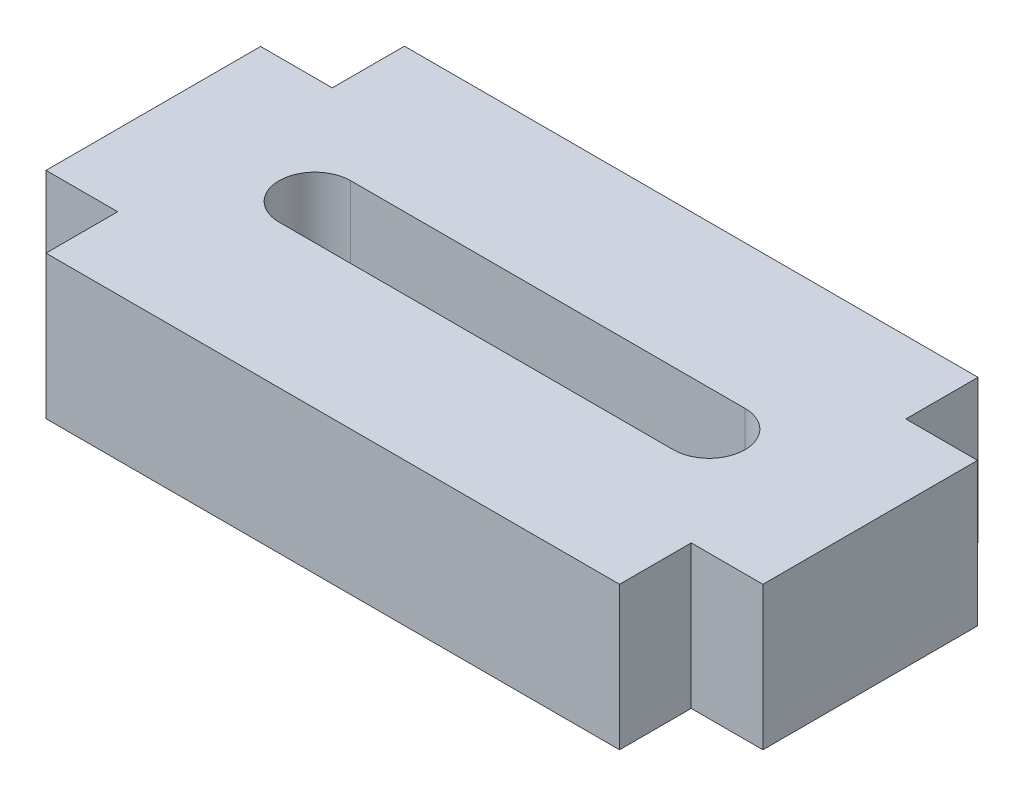
ISO-10303-21;
HEADER;
FILE_DESCRIPTION(('STEP AP214'),'2;1');
FILE_NAME('part.step','',(''),(''),'','','');
FILE_SCHEMA(('AUTOMOTIVE_DESIGN { 1 0 10303 214 1 1 1 1 }'));
ENDSEC;
DATA;
#1=APPLICATION_CONTEXT('core data for automotive mechanical design processes');
#2=APPLICATION_PROTOCOL_DEFINITION('international standard','automotive_design',2000,#1);
#3=PRODUCT_CONTEXT('',#1,'mechanical');
#4=PRODUCT('Part','Part','',(#3));
#5=PRODUCT_RELATED_PRODUCT_CATEGORY('part','',(#4));
#6=PRODUCT_DEFINITION_FORMATION('','',#4);
#7=PRODUCT_DEFINITION_CONTEXT('part definition',#1,'design');
#8=PRODUCT_DEFINITION('design','',#6,#7);
#9=PRODUCT_DEFINITION_SHAPE('','',#8);
#10=(LENGTH_UNIT() NAMED_UNIT(*) SI_UNIT(.MILLI.,.METRE.));
#11=(NAMED_UNIT(*) PLANE_ANGLE_UNIT() SI_UNIT($,.RADIAN.));
#12=(NAMED_UNIT(*) SI_UNIT($,.STERADIAN.) SOLID_ANGLE_UNIT());
#13=UNCERTAINTY_MEASURE_WITH_UNIT(LENGTH_MEASURE(1.E-05),#10,'distance_accuracy_value','');
#14=(GEOMETRIC_REPRESENTATION_CONTEXT(3) GLOBAL_UNCERTAINTY_ASSIGNED_CONTEXT((#13)) GLOBAL_UNIT_ASSIGNED_CONTEXT((#10,
#11,#12)) REPRESENTATION_CONTEXT('',''));
#15=CARTESIAN_POINT('',(0.,0.,0.));
#16=DIRECTION('',(0.,0.,1.));
#17=DIRECTION('',(1.,0.,0.));
#18=AXIS2_PLACEMENT_3D('',#15,#16,#17);
#19=CARTESIAN_POINT('',(-25.,10.,-12.5));
#20=DIRECTION('',(0.,0.,1.));
#21=DIRECTION('',(1.,0.,0.));
#22=AXIS2_PLACEMENT_3D('',#19,#20,#21);
#23=PLANE('',#22);
#24=DIRECTION('',(0.,1.,0.));
#25=VECTOR('',#24,1.);
#26=CARTESIAN_POINT('',(-20.,0.,-12.5));
#27=LINE('',#26,#25);
#28=CARTESIAN_POINT('',(-20.,0.,-12.5));
#29=VERTEX_POINT('',#28);
#30=CARTESIAN_POINT('',(-20.,10.,-12.5));
#31=VERTEX_POINT('',#30);
#32=EDGE_CURVE('E220',#29,#31,#27,.T.);
#33=ORIENTED_EDGE('',*,*,#32,.T.);
#34=DIRECTION('',(-1.,0.,0.));
#35=VECTOR('',#34,1.);
#36=CARTESIAN_POINT('',(-25.,10.,-12.5));
#37=LINE('',#36,#35);
#38=CARTESIAN_POINT('',(20.,10.,-12.5));
#39=VERTEX_POINT('',#38);
#40=EDGE_CURVE('E308',#39,#31,#37,.T.);
#41=ORIENTED_EDGE('',*,*,#40,.F.);
#42=DIRECTION('',(0.,1.,0.));
#43=VECTOR('',#42,1.);
#44=CARTESIAN_POINT('',(20.,0.,-12.5));
#45=LINE('',#44,#43);
#46=CARTESIAN_POINT('',(20.,0.,-12.5));
#47=VERTEX_POINT('',#46);
#48=EDGE_CURVE('E262',#47,#39,#45,.T.);
#49=ORIENTED_EDGE('',*,*,#48,.F.);
#50=DIRECTION('',(-1.,0.,0.));
#51=VECTOR('',#50,1.);
#52=CARTESIAN_POINT('',(-25.,0.,-12.5));
#53=LINE('',#52,#51);
#54=EDGE_CURVE('E318',#47,#29,#53,.T.);
#55=ORIENTED_EDGE('',*,*,#54,.T.);
#56=EDGE_LOOP('',(#33,#41,#49,#55));
#57=FACE_BOUND('',#56,.T.);
#58=ADVANCED_FACE('F39',(#57),#23,.F.);
#59=CARTESIAN_POINT('',(-25.,10.,-12.5));
#60=DIRECTION('',(1.,0.,0.));
#61=DIRECTION('',(0.,0.,-1.));
#62=AXIS2_PLACEMENT_3D('',#59,#60,#61);
#63=PLANE('',#62);
#64=DIRECTION('',(0.,1.,0.));
#65=VECTOR('',#64,1.);
#66=CARTESIAN_POINT('',(-25.,0.,-7.46574739670255));
#67=LINE('',#66,#65);
#68=CARTESIAN_POINT('',(-25.,0.,-7.46574739670255));
#69=VERTEX_POINT('',#68);
#70=CARTESIAN_POINT('',(-25.,10.,-7.46574739670255));
#71=VERTEX_POINT('',#70);
#72=EDGE_CURVE('E211',#69,#71,#67,.T.);
#73=ORIENTED_EDGE('',*,*,#72,.F.);
#74=DIRECTION('',(0.,0.,1.));
#75=VECTOR('',#74,1.);
#76=CARTESIAN_POINT('',(-25.,0.,-12.5));
#77=LINE('',#76,#75);
#78=CARTESIAN_POINT('',(-25.,0.,7.5));
#79=VERTEX_POINT('',#78);
#80=EDGE_CURVE('E321',#69,#79,#77,.T.);
#81=ORIENTED_EDGE('',*,*,#80,.T.);
#82=DIRECTION('',(0.,1.,0.));
#83=VECTOR('',#82,1.);
#84=CARTESIAN_POINT('',(-25.,0.,7.5));
#85=LINE('',#84,#83);
#86=CARTESIAN_POINT('',(-25.,10.,7.5));
#87=VERTEX_POINT('',#86);
#88=EDGE_CURVE('E216',#79,#87,#85,.T.);
#89=ORIENTED_EDGE('',*,*,#88,.T.);
#90=DIRECTION('',(0.,0.,1.));
#91=VECTOR('',#90,1.);
#92=CARTESIAN_POINT('',(-25.,10.,-12.5));
#93=LINE('',#92,#91);
#94=EDGE_CURVE('E49',#71,#87,#93,.T.);
#95=ORIENTED_EDGE('',*,*,#94,.F.);
#96=EDGE_LOOP('',(#73,#81,#89,#95));
#97=FACE_BOUND('',#96,.T.);
#98=ADVANCED_FACE('F359',(#97),#63,.F.);
#99=CARTESIAN_POINT('',(-25.,10.,12.5));
#100=DIRECTION('',(0.,0.,-1.));
#101=DIRECTION('',(-1.,0.,0.));
#102=AXIS2_PLACEMENT_3D('',#99,#100,#101);
#103=PLANE('',#102);
#104=DIRECTION('',(0.,1.,0.));
#105=VECTOR('',#104,1.);
#106=CARTESIAN_POINT('',(-20.,0.,12.5));
#107=LINE('',#106,#105);
#108=CARTESIAN_POINT('',(-20.,0.,12.5));
#109=VERTEX_POINT('',#108);
#110=CARTESIAN_POINT('',(-20.,10.,12.5));
#111=VERTEX_POINT('',#110);
#112=EDGE_CURVE('E238',#109,#111,#107,.T.);
#113=ORIENTED_EDGE('',*,*,#112,.F.);
#114=DIRECTION('',(1.,0.,0.));
#115=VECTOR('',#114,1.);
#116=CARTESIAN_POINT('',(-25.,0.,12.5));
#117=LINE('',#116,#115);
#118=CARTESIAN_POINT('',(20.,0.,12.5));
#119=VERTEX_POINT('',#118);
#120=EDGE_CURVE('E43',#109,#119,#117,.T.);
#121=ORIENTED_EDGE('',*,*,#120,.T.);
#122=DIRECTION('',(0.,1.,0.));
#123=VECTOR('',#122,1.);
#124=CARTESIAN_POINT('',(20.,0.,12.5));
#125=LINE('',#124,#123);
#126=CARTESIAN_POINT('',(20.,10.,12.5));
#127=VERTEX_POINT('',#126);
#128=EDGE_CURVE('E267',#119,#127,#125,.T.);
#129=ORIENTED_EDGE('',*,*,#128,.T.);
#130=DIRECTION('',(1.,0.,0.));
#131=VECTOR('',#130,1.);
#132=CARTESIAN_POINT('',(-25.,10.,12.5));
#133=LINE('',#132,#131);
#134=EDGE_CURVE('E11',#111,#127,#133,.T.);
#135=ORIENTED_EDGE('',*,*,#134,.F.);
#136=EDGE_LOOP('',(#113,#121,#129,#135));
#137=FACE_BOUND('',#136,.T.);
#138=ADVANCED_FACE('F332',(#137),#103,.F.);
#139=CARTESIAN_POINT('',(0.,10.,0.));
#140=DIRECTION('',(0.,1.,0.));
#141=DIRECTION('',(0.,0.,1.));
#142=AXIS2_PLACEMENT_3D('',#139,#140,#141);
#143=PLANE('',#142);
#144=CARTESIAN_POINT('',(-13.75,10.,0.));
#145=DIRECTION('',(0.,1.,0.));
#146=DIRECTION('',(0.,0.,1.));
#147=AXIS2_PLACEMENT_3D('',#144,#145,#146);
#148=CIRCLE('',#147,2.5);
#149=CARTESIAN_POINT('',(-13.75,10.,-2.5));
#150=VERTEX_POINT('',#149);
#151=CARTESIAN_POINT('',(-13.75,10.,2.5));
#152=VERTEX_POINT('',#151);
#153=EDGE_CURVE('E57',#150,#152,#148,.T.);
#154=ORIENTED_EDGE('',*,*,#153,.F.);
#155=DIRECTION('',(-1.,0.,0.));
#156=VECTOR('',#155,1.);
#157=CARTESIAN_POINT('',(-13.75,10.,-2.5));
#158=LINE('',#157,#156);
#159=CARTESIAN_POINT('',(13.75,10.,-2.50000000000001));
#160=VERTEX_POINT('',#159);
#161=EDGE_CURVE('E175',#160,#150,#158,.T.);
#162=ORIENTED_EDGE('',*,*,#161,.F.);
#163=CARTESIAN_POINT('',(13.75,10.,0.));
#164=DIRECTION('',(0.,1.,0.));
#165=DIRECTION('',(0.,0.,1.));
#166=AXIS2_PLACEMENT_3D('',#163,#164,#165);
#167=CIRCLE('',#166,2.5);
#168=CARTESIAN_POINT('',(13.75,10.,2.5));
#169=VERTEX_POINT('',#168);
#170=EDGE_CURVE('E179',#169,#160,#167,.T.);
#171=ORIENTED_EDGE('',*,*,#170,.F.);
#172=DIRECTION('',(1.,0.,0.));
#173=VECTOR('',#172,1.);
#174=CARTESIAN_POINT('',(-13.75,10.,2.5));
#175=LINE('',#174,#173);
#176=EDGE_CURVE('E188',#152,#169,#175,.T.);
#177=ORIENTED_EDGE('',*,*,#176,.F.);
#178=EDGE_LOOP('',(#154,#162,#171,#177));
#179=FACE_BOUND('',#178,.T.);
#180=ORIENTED_EDGE('',*,*,#40,.T.);
#181=DIRECTION('',(0.,0.,1.));
#182=VECTOR('',#181,1.);
#183=CARTESIAN_POINT('',(-20.,10.,-12.5));
#184=LINE('',#183,#182);
#185=CARTESIAN_POINT('',(-20.,10.,-7.46574739670255));
#186=VERTEX_POINT('',#185);
#187=EDGE_CURVE('E207',#31,#186,#184,.T.);
#188=ORIENTED_EDGE('',*,*,#187,.T.);
#189=DIRECTION('',(-1.,0.,0.));
#190=VECTOR('',#189,1.);
#191=CARTESIAN_POINT('',(-25.,10.,-7.46574739670255));
#192=LINE('',#191,#190);
#193=EDGE_CURVE('E212',#186,#71,#192,.T.);
#194=ORIENTED_EDGE('',*,*,#193,.T.);
#195=ORIENTED_EDGE('',*,*,#94,.T.);
#196=DIRECTION('',(1.,0.,0.));
#197=VECTOR('',#196,1.);
#198=CARTESIAN_POINT('',(-25.,10.,7.5));
#199=LINE('',#198,#197);
#200=CARTESIAN_POINT('',(-20.,10.,7.50000000000001));
#201=VERTEX_POINT('',#200);
#202=EDGE_CURVE('E234',#87,#201,#199,.T.);
#203=ORIENTED_EDGE('',*,*,#202,.T.);
#204=DIRECTION('',(0.,0.,1.));
#205=VECTOR('',#204,1.);
#206=CARTESIAN_POINT('',(-20.,10.,12.5));
#207=LINE('',#206,#205);
#208=EDGE_CURVE('E197',#201,#111,#207,.T.);
#209=ORIENTED_EDGE('',*,*,#208,.T.);
#210=ORIENTED_EDGE('',*,*,#134,.T.);
#211=DIRECTION('',(0.,0.,1.));
#212=VECTOR('',#211,1.);
#213=CARTESIAN_POINT('',(20.,10.,12.5));
#214=LINE('',#213,#212);
#215=CARTESIAN_POINT('',(20.,10.,7.50000000000001));
#216=VERTEX_POINT('',#215);
#217=EDGE_CURVE('E285',#216,#127,#214,.T.);
#218=ORIENTED_EDGE('',*,*,#217,.F.);
#219=DIRECTION('',(-1.,0.,0.));
#220=VECTOR('',#219,1.);
#221=CARTESIAN_POINT('',(25.,10.,7.5));
#222=LINE('',#221,#220);
#223=CARTESIAN_POINT('',(25.,10.,7.5));
#224=VERTEX_POINT('',#223);
#225=EDGE_CURVE('E224',#224,#216,#222,.T.);
#226=ORIENTED_EDGE('',*,*,#225,.F.);
#227=DIRECTION('',(0.,0.,-1.));
#228=VECTOR('',#227,1.);
#229=CARTESIAN_POINT('',(25.,10.,-12.5));
#230=LINE('',#229,#228);
#231=CARTESIAN_POINT('',(25.,10.,-7.46574739670255));
#232=VERTEX_POINT('',#231);
#233=EDGE_CURVE('E304',#224,#232,#230,.T.);
#234=ORIENTED_EDGE('',*,*,#233,.T.);
#235=DIRECTION('',(1.,0.,0.));
#236=VECTOR('',#235,1.);
#237=CARTESIAN_POINT('',(25.,10.,-7.46574739670255));
#238=LINE('',#237,#236);
#239=CARTESIAN_POINT('',(20.,10.,-7.46574739670255));
#240=VERTEX_POINT('',#239);
#241=EDGE_CURVE('E258',#240,#232,#238,.T.);
#242=ORIENTED_EDGE('',*,*,#241,.F.);
#243=DIRECTION('',(0.,0.,1.));
#244=VECTOR('',#243,1.);
#245=CARTESIAN_POINT('',(20.,10.,-12.5));
#246=LINE('',#245,#244);
#247=EDGE_CURVE('E263',#39,#240,#246,.T.);
#248=ORIENTED_EDGE('',*,*,#247,.F.);
#249=EDGE_LOOP('',(#180,#188,#194,#195,#203,#209,#210,#218,#226,#234,#242,#248));
#250=FACE_BOUND('',#249,.T.);
#251=ADVANCED_FACE('F349',(#179,#250),#143,.T.);
#252=CARTESIAN_POINT('',(0.,0.,0.));
#253=DIRECTION('',(0.,1.,0.));
#254=DIRECTION('',(0.,0.,1.));
#255=AXIS2_PLACEMENT_3D('',#252,#253,#254);
#256=PLANE('',#255);
#257=DIRECTION('',(-1.,0.,0.));
#258=VECTOR('',#257,1.);
#259=CARTESIAN_POINT('',(-13.75,0.,-2.5));
#260=LINE('',#259,#258);
#261=CARTESIAN_POINT('',(13.75,0.,-2.50000000000001));
#262=VERTEX_POINT('',#261);
#263=CARTESIAN_POINT('',(-13.75,0.,-2.5));
#264=VERTEX_POINT('',#263);
#265=EDGE_CURVE('E163',#262,#264,#260,.T.);
#266=ORIENTED_EDGE('',*,*,#265,.T.);
#267=CARTESIAN_POINT('',(-13.75,0.,0.));
#268=DIRECTION('',(0.,1.,0.));
#269=DIRECTION('',(0.,0.,1.));
#270=AXIS2_PLACEMENT_3D('',#267,#268,#269);
#271=CIRCLE('',#270,2.5);
#272=CARTESIAN_POINT('',(-13.75,0.,2.5));
#273=VERTEX_POINT('',#272);
#274=EDGE_CURVE('E156',#264,#273,#271,.T.);
#275=ORIENTED_EDGE('',*,*,#274,.T.);
#276=DIRECTION('',(1.,0.,0.));
#277=VECTOR('',#276,1.);
#278=CARTESIAN_POINT('',(-13.75,0.,2.5));
#279=LINE('',#278,#277);
#280=CARTESIAN_POINT('',(13.75,0.,2.49999999999999));
#281=VERTEX_POINT('',#280);
#282=EDGE_CURVE('E166',#273,#281,#279,.T.);
#283=ORIENTED_EDGE('',*,*,#282,.T.);
#284=CARTESIAN_POINT('',(13.75,0.,0.));
#285=DIRECTION('',(0.,1.,0.));
#286=DIRECTION('',(0.,0.,1.));
#287=AXIS2_PLACEMENT_3D('',#284,#285,#286);
#288=CIRCLE('',#287,2.5);
#289=EDGE_CURVE('E65',#281,#262,#288,.T.);
#290=ORIENTED_EDGE('',*,*,#289,.T.);
#291=EDGE_LOOP('',(#266,#275,#283,#290));
#292=FACE_BOUND('',#291,.T.);
#293=DIRECTION('',(0.,0.,1.));
#294=VECTOR('',#293,1.);
#295=CARTESIAN_POINT('',(-20.,0.,-12.5));
#296=LINE('',#295,#294);
#297=CARTESIAN_POINT('',(-20.,0.,-7.46574739670255));
#298=VERTEX_POINT('',#297);
#299=EDGE_CURVE('E206',#29,#298,#296,.T.);
#300=ORIENTED_EDGE('',*,*,#299,.F.);
#301=ORIENTED_EDGE('',*,*,#54,.F.);
#302=DIRECTION('',(0.,0.,1.));
#303=VECTOR('',#302,1.);
#304=CARTESIAN_POINT('',(20.,0.,-12.5));
#305=LINE('',#304,#303);
#306=CARTESIAN_POINT('',(20.,0.,-7.46574739670255));
#307=VERTEX_POINT('',#306);
#308=EDGE_CURVE('E253',#47,#307,#305,.T.);
#309=ORIENTED_EDGE('',*,*,#308,.T.);
#310=DIRECTION('',(1.,0.,0.));
#311=VECTOR('',#310,1.);
#312=CARTESIAN_POINT('',(25.,0.,-7.46574739670255));
#313=LINE('',#312,#311);
#314=CARTESIAN_POINT('',(25.,0.,-7.46574739670255));
#315=VERTEX_POINT('',#314);
#316=EDGE_CURVE('E257',#307,#315,#313,.T.);
#317=ORIENTED_EDGE('',*,*,#316,.T.);
#318=DIRECTION('',(0.,0.,-1.));
#319=VECTOR('',#318,1.);
#320=CARTESIAN_POINT('',(25.,0.,-12.5));
#321=LINE('',#320,#319);
#322=CARTESIAN_POINT('',(25.,0.,7.5));
#323=VERTEX_POINT('',#322);
#324=EDGE_CURVE('E274',#323,#315,#321,.T.);
#325=ORIENTED_EDGE('',*,*,#324,.F.);
#326=DIRECTION('',(-1.,0.,0.));
#327=VECTOR('',#326,1.);
#328=CARTESIAN_POINT('',(25.,0.,7.5));
#329=LINE('',#328,#327);
#330=CARTESIAN_POINT('',(20.,0.,7.50000000000001));
#331=VERTEX_POINT('',#330);
#332=EDGE_CURVE('E280',#323,#331,#329,.T.);
#333=ORIENTED_EDGE('',*,*,#332,.T.);
#334=DIRECTION('',(0.,0.,1.));
#335=VECTOR('',#334,1.);
#336=CARTESIAN_POINT('',(20.,0.,12.5));
#337=LINE('',#336,#335);
#338=EDGE_CURVE('E284',#331,#119,#337,.T.);
#339=ORIENTED_EDGE('',*,*,#338,.T.);
#340=ORIENTED_EDGE('',*,*,#120,.F.);
#341=DIRECTION('',(0.,0.,1.));
#342=VECTOR('',#341,1.);
#343=CARTESIAN_POINT('',(-20.,0.,12.5));
#344=LINE('',#343,#342);
#345=CARTESIAN_POINT('',(-20.,0.,7.50000000000001));
#346=VERTEX_POINT('',#345);
#347=EDGE_CURVE('E230',#346,#109,#344,.T.);
#348=ORIENTED_EDGE('',*,*,#347,.F.);
#349=DIRECTION('',(1.,0.,0.));
#350=VECTOR('',#349,1.);
#351=CARTESIAN_POINT('',(-25.,0.,7.5));
#352=LINE('',#351,#350);
#353=EDGE_CURVE('E233',#79,#346,#352,.T.);
#354=ORIENTED_EDGE('',*,*,#353,.F.);
#355=ORIENTED_EDGE('',*,*,#80,.F.);
#356=DIRECTION('',(-1.,0.,0.));
#357=VECTOR('',#356,1.);
#358=CARTESIAN_POINT('',(-25.,0.,-7.46574739670255));
#359=LINE('',#358,#357);
#360=EDGE_CURVE('E203',#298,#69,#359,.T.);
#361=ORIENTED_EDGE('',*,*,#360,.F.);
#362=EDGE_LOOP('',(#300,#301,#309,#317,#325,#333,#339,#340,#348,#354,#355,#361));
#363=FACE_BOUND('',#362,.T.);
#364=ADVANCED_FACE('F171',(#292,#363),#256,.F.);
#365=CARTESIAN_POINT('',(25.,10.,-12.5));
#366=DIRECTION('',(-1.,0.,0.));
#367=DIRECTION('',(0.,0.,1.));
#368=AXIS2_PLACEMENT_3D('',#365,#366,#367);
#369=PLANE('',#368);
#370=ORIENTED_EDGE('',*,*,#324,.T.);
#371=DIRECTION('',(0.,1.,0.));
#372=VECTOR('',#371,1.);
#373=CARTESIAN_POINT('',(25.,0.,-7.46574739670255));
#374=LINE('',#373,#372);
#375=EDGE_CURVE('E270',#315,#232,#374,.T.);
#376=ORIENTED_EDGE('',*,*,#375,.T.);
#377=ORIENTED_EDGE('',*,*,#233,.F.);
#378=DIRECTION('',(0.,1.,0.));
#379=VECTOR('',#378,1.);
#380=CARTESIAN_POINT('',(25.,0.,7.5));
#381=LINE('',#380,#379);
#382=EDGE_CURVE('E289',#323,#224,#381,.T.);
#383=ORIENTED_EDGE('',*,*,#382,.F.);
#384=EDGE_LOOP('',(#370,#376,#377,#383));
#385=FACE_BOUND('',#384,.T.);
#386=ADVANCED_FACE('F41',(#385),#369,.F.);
#387=CARTESIAN_POINT('',(20.,0.,12.5));
#388=DIRECTION('',(-1.,0.,0.));
#389=DIRECTION('',(0.,0.,1.));
#390=AXIS2_PLACEMENT_3D('',#387,#388,#389);
#391=PLANE('',#390);
#392=ORIENTED_EDGE('',*,*,#217,.T.);
#393=ORIENTED_EDGE('',*,*,#128,.F.);
#394=ORIENTED_EDGE('',*,*,#338,.F.);
#395=DIRECTION('',(0.,1.,0.));
#396=VECTOR('',#395,1.);
#397=CARTESIAN_POINT('',(20.,0.,7.50000000000001));
#398=LINE('',#397,#396);
#399=EDGE_CURVE('E299',#331,#216,#398,.T.);
#400=ORIENTED_EDGE('',*,*,#399,.T.);
#401=EDGE_LOOP('',(#392,#393,#394,#400));
#402=FACE_BOUND('',#401,.T.);
#403=ADVANCED_FACE('F336',(#402),#391,.F.);
#404=CARTESIAN_POINT('',(25.,0.,7.5));
#405=DIRECTION('',(0.,0.,-1.));
#406=DIRECTION('',(-1.,0.,0.));
#407=AXIS2_PLACEMENT_3D('',#404,#405,#406);
#408=PLANE('',#407);
#409=ORIENTED_EDGE('',*,*,#225,.T.);
#410=ORIENTED_EDGE('',*,*,#399,.F.);
#411=ORIENTED_EDGE('',*,*,#332,.F.);
#412=ORIENTED_EDGE('',*,*,#382,.T.);
#413=EDGE_LOOP('',(#409,#410,#411,#412));
#414=FACE_BOUND('',#413,.T.);
#415=ADVANCED_FACE('F343',(#414),#408,.F.);
#416=CARTESIAN_POINT('',(25.,0.,-7.46574739670255));
#417=DIRECTION('',(0.,0.,1.));
#418=DIRECTION('',(1.,0.,0.));
#419=AXIS2_PLACEMENT_3D('',#416,#417,#418);
#420=PLANE('',#419);
#421=ORIENTED_EDGE('',*,*,#241,.T.);
#422=ORIENTED_EDGE('',*,*,#375,.F.);
#423=ORIENTED_EDGE('',*,*,#316,.F.);
#424=DIRECTION('',(0.,1.,0.));
#425=VECTOR('',#424,1.);
#426=CARTESIAN_POINT('',(20.,0.,-7.46574739670255));
#427=LINE('',#426,#425);
#428=EDGE_CURVE('E275',#307,#240,#427,.T.);
#429=ORIENTED_EDGE('',*,*,#428,.T.);
#430=EDGE_LOOP('',(#421,#422,#423,#429));
#431=FACE_BOUND('',#430,.T.);
#432=ADVANCED_FACE('F372',(#431),#420,.F.);
#433=CARTESIAN_POINT('',(20.,0.,-12.5));
#434=DIRECTION('',(-1.,0.,0.));
#435=DIRECTION('',(0.,0.,1.));
#436=AXIS2_PLACEMENT_3D('',#433,#434,#435);
#437=PLANE('',#436);
#438=ORIENTED_EDGE('',*,*,#247,.T.);
#439=ORIENTED_EDGE('',*,*,#428,.F.);
#440=ORIENTED_EDGE('',*,*,#308,.F.);
#441=ORIENTED_EDGE('',*,*,#48,.T.);
#442=EDGE_LOOP('',(#438,#439,#440,#441));
#443=FACE_BOUND('',#442,.T.);
#444=ADVANCED_FACE('F369',(#443),#437,.F.);
#445=CARTESIAN_POINT('',(-25.,0.,7.5));
#446=DIRECTION('',(0.,0.,1.));
#447=DIRECTION('',(1.,0.,0.));
#448=AXIS2_PLACEMENT_3D('',#445,#446,#447);
#449=PLANE('',#448);
#450=ORIENTED_EDGE('',*,*,#202,.F.);
#451=ORIENTED_EDGE('',*,*,#88,.F.);
#452=ORIENTED_EDGE('',*,*,#353,.T.);
#453=DIRECTION('',(0.,1.,0.));
#454=VECTOR('',#453,1.);
#455=CARTESIAN_POINT('',(-20.,0.,7.50000000000001));
#456=LINE('',#455,#454);
#457=EDGE_CURVE('E248',#346,#201,#456,.T.);
#458=ORIENTED_EDGE('',*,*,#457,.T.);
#459=EDGE_LOOP('',(#450,#451,#452,#458));
#460=FACE_BOUND('',#459,.T.);
#461=ADVANCED_FACE('F357',(#460),#449,.T.);
#462=CARTESIAN_POINT('',(-20.,0.,12.5));
#463=DIRECTION('',(-1.,0.,0.));
#464=DIRECTION('',(0.,0.,1.));
#465=AXIS2_PLACEMENT_3D('',#462,#463,#464);
#466=PLANE('',#465);
#467=ORIENTED_EDGE('',*,*,#208,.F.);
#468=ORIENTED_EDGE('',*,*,#457,.F.);
#469=ORIENTED_EDGE('',*,*,#347,.T.);
#470=ORIENTED_EDGE('',*,*,#112,.T.);
#471=EDGE_LOOP('',(#467,#468,#469,#470));
#472=FACE_BOUND('',#471,.T.);
#473=ADVANCED_FACE('F353',(#472),#466,.T.);
#474=CARTESIAN_POINT('',(-20.,0.,-12.5));
#475=DIRECTION('',(-1.,0.,0.));
#476=DIRECTION('',(0.,0.,1.));
#477=AXIS2_PLACEMENT_3D('',#474,#475,#476);
#478=PLANE('',#477);
#479=ORIENTED_EDGE('',*,*,#187,.F.);
#480=ORIENTED_EDGE('',*,*,#32,.F.);
#481=ORIENTED_EDGE('',*,*,#299,.T.);
#482=DIRECTION('',(0.,1.,0.));
#483=VECTOR('',#482,1.);
#484=CARTESIAN_POINT('',(-20.,0.,-7.46574739670255));
#485=LINE('',#484,#483);
#486=EDGE_CURVE('E225',#298,#186,#485,.T.);
#487=ORIENTED_EDGE('',*,*,#486,.T.);
#488=EDGE_LOOP('',(#479,#480,#481,#487));
#489=FACE_BOUND('',#488,.T.);
#490=ADVANCED_FACE('F459',(#489),#478,.T.);
#491=CARTESIAN_POINT('',(-25.,0.,-7.46574739670255));
#492=DIRECTION('',(0.,0.,-1.));
#493=DIRECTION('',(-1.,0.,0.));
#494=AXIS2_PLACEMENT_3D('',#491,#492,#493);
#495=PLANE('',#494);
#496=ORIENTED_EDGE('',*,*,#193,.F.);
#497=ORIENTED_EDGE('',*,*,#486,.F.);
#498=ORIENTED_EDGE('',*,*,#360,.T.);
#499=ORIENTED_EDGE('',*,*,#72,.T.);
#500=EDGE_LOOP('',(#496,#497,#498,#499));
#501=FACE_BOUND('',#500,.T.);
#502=ADVANCED_FACE('F362',(#501),#495,.T.);
#503=CARTESIAN_POINT('',(-13.75,0.,0.));
#504=DIRECTION('',(0.,1.,0.));
#505=DIRECTION('',(0.,0.,1.));
#506=AXIS2_PLACEMENT_3D('',#503,#504,#505);
#507=CYLINDRICAL_SURFACE('',#506,2.5);
#508=ORIENTED_EDGE('',*,*,#153,.T.);
#509=DIRECTION('',(0.,1.,0.));
#510=VECTOR('',#509,1.);
#511=CARTESIAN_POINT('',(-13.75,0.,2.5));
#512=LINE('',#511,#510);
#513=EDGE_CURVE('E152',#273,#152,#512,.T.);
#514=ORIENTED_EDGE('',*,*,#513,.F.);
#515=ORIENTED_EDGE('',*,*,#274,.F.);
#516=DIRECTION('',(0.,1.,0.));
#517=VECTOR('',#516,1.);
#518=CARTESIAN_POINT('',(-13.75,0.,-2.5));
#519=LINE('',#518,#517);
#520=EDGE_CURVE('E194',#264,#150,#519,.T.);
#521=ORIENTED_EDGE('',*,*,#520,.T.);
#522=EDGE_LOOP('',(#508,#514,#515,#521));
#523=FACE_BOUND('',#522,.T.);
#524=ADVANCED_FACE('F154',(#523),#507,.F.);
#525=CARTESIAN_POINT('',(-13.75,0.,-2.5));
#526=DIRECTION('',(0.,0.,-1.));
#527=DIRECTION('',(-1.,0.,0.));
#528=AXIS2_PLACEMENT_3D('',#525,#526,#527);
#529=PLANE('',#528);
#530=ORIENTED_EDGE('',*,*,#161,.T.);
#531=ORIENTED_EDGE('',*,*,#520,.F.);
#532=ORIENTED_EDGE('',*,*,#265,.F.);
#533=DIRECTION('',(0.,1.,0.));
#534=VECTOR('',#533,1.);
#535=CARTESIAN_POINT('',(13.75,0.,-2.50000000000001));
#536=LINE('',#535,#534);
#537=EDGE_CURVE('E198',#262,#160,#536,.T.);
#538=ORIENTED_EDGE('',*,*,#537,.T.);
#539=EDGE_LOOP('',(#530,#531,#532,#538));
#540=FACE_BOUND('',#539,.T.);
#541=ADVANCED_FACE('F475',(#540),#529,.F.);
#542=CARTESIAN_POINT('',(13.75,0.,0.));
#543=DIRECTION('',(0.,1.,0.));
#544=DIRECTION('',(0.,0.,1.));
#545=AXIS2_PLACEMENT_3D('',#542,#543,#544);
#546=CYLINDRICAL_SURFACE('',#545,2.5);
#547=ORIENTED_EDGE('',*,*,#170,.T.);
#548=ORIENTED_EDGE('',*,*,#537,.F.);
#549=ORIENTED_EDGE('',*,*,#289,.F.);
#550=DIRECTION('',(0.,1.,0.));
#551=VECTOR('',#550,1.);
#552=CARTESIAN_POINT('',(13.75,0.,2.5));
#553=LINE('',#552,#551);
#554=EDGE_CURVE('E162',#281,#169,#553,.T.);
#555=ORIENTED_EDGE('',*,*,#554,.T.);
#556=EDGE_LOOP('',(#547,#548,#549,#555));
#557=FACE_BOUND('',#556,.T.);
#558=ADVANCED_FACE('F482',(#557),#546,.F.);
#559=CARTESIAN_POINT('',(-13.75,0.,2.5));
#560=DIRECTION('',(0.,0.,1.));
#561=DIRECTION('',(1.,0.,0.));
#562=AXIS2_PLACEMENT_3D('',#559,#560,#561);
#563=PLANE('',#562);
#564=ORIENTED_EDGE('',*,*,#176,.T.);
#565=ORIENTED_EDGE('',*,*,#554,.F.);
#566=ORIENTED_EDGE('',*,*,#282,.F.);
#567=ORIENTED_EDGE('',*,*,#513,.T.);
#568=EDGE_LOOP('',(#564,#565,#566,#567));
#569=FACE_BOUND('',#568,.T.);
#570=ADVANCED_FACE('F167',(#569),#563,.F.);
#571=CLOSED_SHELL('',(#58,#98,#138,#251,#364,#386,#403,#415,#432,#444,#461,#473,#490,#502,#524,
#541,#558,#570));
#572=MANIFOLD_SOLID_BREP('B2',#571);
#573=ADVANCED_BREP_SHAPE_REPRESENTATION('',(#18,#572),#14);
#574=SHAPE_DEFINITION_REPRESENTATION(#9,#573);
ENDSEC;
END-ISO-10303-21;
